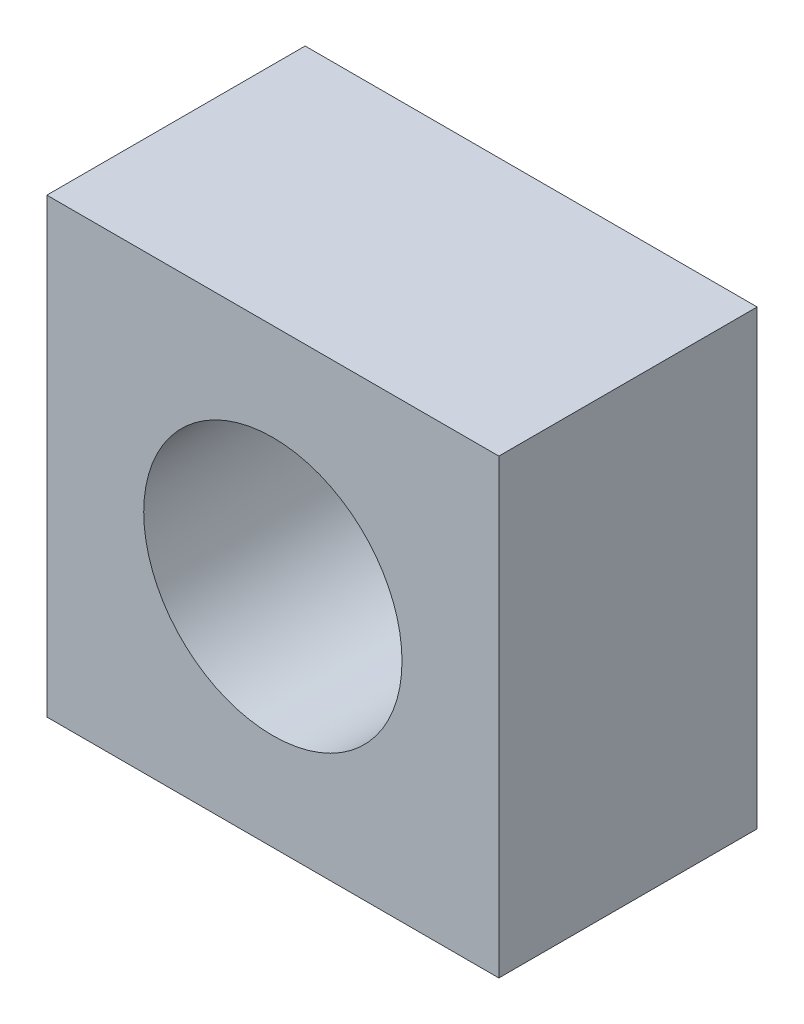
ISO-10303-21;
HEADER;
FILE_DESCRIPTION(('STEP AP214'),'2;1');
FILE_NAME('part.step','',(''),(''),'','','');
FILE_SCHEMA(('AUTOMOTIVE_DESIGN { 1 0 10303 214 1 1 1 1 }'));
ENDSEC;
DATA;
#1=APPLICATION_CONTEXT('core data for automotive mechanical design processes');
#2=APPLICATION_PROTOCOL_DEFINITION('international standard','automotive_design',2000,#1);
#3=PRODUCT_CONTEXT('',#1,'mechanical');
#4=PRODUCT('Part','Part','',(#3));
#5=PRODUCT_RELATED_PRODUCT_CATEGORY('part','',(#4));
#6=PRODUCT_DEFINITION_FORMATION('','',#4);
#7=PRODUCT_DEFINITION_CONTEXT('part definition',#1,'design');
#8=PRODUCT_DEFINITION('design','',#6,#7);
#9=PRODUCT_DEFINITION_SHAPE('','',#8);
#10=(LENGTH_UNIT() NAMED_UNIT(*) SI_UNIT(.MILLI.,.METRE.));
#11=(NAMED_UNIT(*) PLANE_ANGLE_UNIT() SI_UNIT($,.RADIAN.));
#12=(NAMED_UNIT(*) SI_UNIT($,.STERADIAN.) SOLID_ANGLE_UNIT());
#13=UNCERTAINTY_MEASURE_WITH_UNIT(LENGTH_MEASURE(1.E-05),#10,'distance_accuracy_value','');
#14=(GEOMETRIC_REPRESENTATION_CONTEXT(3) GLOBAL_UNCERTAINTY_ASSIGNED_CONTEXT((#13)) GLOBAL_UNIT_ASSIGNED_CONTEXT((#10,
#11,#12)) REPRESENTATION_CONTEXT('',''));
#15=CARTESIAN_POINT('',(0.,0.,0.));
#16=DIRECTION('',(0.,0.,1.));
#17=DIRECTION('',(1.,0.,0.));
#18=AXIS2_PLACEMENT_3D('',#15,#16,#17);
#19=CARTESIAN_POINT('',(0.,0.,12.7));
#20=DIRECTION('',(0.,0.,-1.));
#21=DIRECTION('',(-1.,0.,0.));
#22=AXIS2_PLACEMENT_3D('',#19,#20,#21);
#23=PLANE('',#22);
#24=DIRECTION('',(0.,1.,0.));
#25=VECTOR('',#24,1.);
#26=CARTESIAN_POINT('',(11.1125,-11.1125,12.7));
#27=LINE('',#26,#25);
#28=CARTESIAN_POINT('',(11.1125,-11.1125,12.7));
#29=VERTEX_POINT('',#28);
#30=CARTESIAN_POINT('',(11.1125,11.1125,12.7));
#31=VERTEX_POINT('',#30);
#32=EDGE_CURVE('E84',#29,#31,#27,.T.);
#33=ORIENTED_EDGE('',*,*,#32,.T.);
#34=DIRECTION('',(-1.,0.,0.));
#35=VECTOR('',#34,1.);
#36=CARTESIAN_POINT('',(-11.1125,11.1125,12.7));
#37=LINE('',#36,#35);
#38=CARTESIAN_POINT('',(-11.1125,11.1125,12.7));
#39=VERTEX_POINT('',#38);
#40=EDGE_CURVE('E79',#31,#39,#37,.T.);
#41=ORIENTED_EDGE('',*,*,#40,.T.);
#42=DIRECTION('',(0.,-1.,0.));
#43=VECTOR('',#42,1.);
#44=CARTESIAN_POINT('',(-11.1125,-11.1125,12.7));
#45=LINE('',#44,#43);
#46=CARTESIAN_POINT('',(-11.1125,-11.1125,12.7));
#47=VERTEX_POINT('',#46);
#48=EDGE_CURVE('E82',#39,#47,#45,.T.);
#49=ORIENTED_EDGE('',*,*,#48,.T.);
#50=DIRECTION('',(1.,0.,0.));
#51=VECTOR('',#50,1.);
#52=CARTESIAN_POINT('',(-11.1125,-11.1125,12.7));
#53=LINE('',#52,#51);
#54=EDGE_CURVE('E49',#47,#29,#53,.T.);
#55=ORIENTED_EDGE('',*,*,#54,.T.);
#56=EDGE_LOOP('',(#33,#41,#49,#55));
#57=FACE_BOUND('',#56,.T.);
#58=CARTESIAN_POINT('',(0.,0.,12.7));
#59=DIRECTION('',(0.,0.,1.));
#60=DIRECTION('',(1.,0.,0.));
#61=AXIS2_PLACEMENT_3D('',#58,#59,#60);
#62=CIRCLE('',#61,6.35);
#63=CARTESIAN_POINT('',(6.35,0.,12.7));
#64=VERTEX_POINT('',#63);
#65=EDGE_CURVE('E99',#64,#64,#62,.T.);
#66=ORIENTED_EDGE('',*,*,#65,.F.);
#67=EDGE_LOOP('',(#66));
#68=FACE_BOUND('',#67,.T.);
#69=ADVANCED_FACE('F32',(#57,#68),#23,.F.);
#70=CARTESIAN_POINT('',(0.,0.,0.));
#71=DIRECTION('',(0.,0.,-1.));
#72=DIRECTION('',(-1.,0.,0.));
#73=AXIS2_PLACEMENT_3D('',#70,#71,#72);
#74=PLANE('',#73);
#75=DIRECTION('',(0.,1.,0.));
#76=VECTOR('',#75,1.);
#77=CARTESIAN_POINT('',(11.1125,-11.1125,0.));
#78=LINE('',#77,#76);
#79=CARTESIAN_POINT('',(11.1125,-11.1125,0.));
#80=VERTEX_POINT('',#79);
#81=CARTESIAN_POINT('',(11.1125,11.1125,0.));
#82=VERTEX_POINT('',#81);
#83=EDGE_CURVE('E96',#80,#82,#78,.T.);
#84=ORIENTED_EDGE('',*,*,#83,.F.);
#85=DIRECTION('',(1.,0.,0.));
#86=VECTOR('',#85,1.);
#87=CARTESIAN_POINT('',(-11.1125,-11.1125,0.));
#88=LINE('',#87,#86);
#89=CARTESIAN_POINT('',(-11.1125,-11.1125,0.));
#90=VERTEX_POINT('',#89);
#91=EDGE_CURVE('E72',#90,#80,#88,.T.);
#92=ORIENTED_EDGE('',*,*,#91,.F.);
#93=DIRECTION('',(0.,-1.,0.));
#94=VECTOR('',#93,1.);
#95=CARTESIAN_POINT('',(-11.1125,-11.1125,0.));
#96=LINE('',#95,#94);
#97=CARTESIAN_POINT('',(-11.1125,11.1125,0.));
#98=VERTEX_POINT('',#97);
#99=EDGE_CURVE('E66',#98,#90,#96,.T.);
#100=ORIENTED_EDGE('',*,*,#99,.F.);
#101=DIRECTION('',(-1.,0.,0.));
#102=VECTOR('',#101,1.);
#103=CARTESIAN_POINT('',(-11.1125,11.1125,0.));
#104=LINE('',#103,#102);
#105=EDGE_CURVE('E88',#82,#98,#104,.T.);
#106=ORIENTED_EDGE('',*,*,#105,.F.);
#107=EDGE_LOOP('',(#84,#92,#100,#106));
#108=FACE_BOUND('',#107,.T.);
#109=CARTESIAN_POINT('',(0.,0.,0.));
#110=DIRECTION('',(0.,0.,1.));
#111=DIRECTION('',(1.,0.,0.));
#112=AXIS2_PLACEMENT_3D('',#109,#110,#111);
#113=CIRCLE('',#112,6.35);
#114=CARTESIAN_POINT('',(6.35,0.,0.));
#115=VERTEX_POINT('',#114);
#116=EDGE_CURVE('E111',#115,#115,#113,.T.);
#117=ORIENTED_EDGE('',*,*,#116,.T.);
#118=EDGE_LOOP('',(#117));
#119=FACE_BOUND('',#118,.T.);
#120=ADVANCED_FACE('F107',(#108,#119),#74,.T.);
#121=CARTESIAN_POINT('',(11.1125,-11.1125,12.7));
#122=DIRECTION('',(-1.,0.,0.));
#123=DIRECTION('',(0.,0.,1.));
#124=AXIS2_PLACEMENT_3D('',#121,#122,#123);
#125=PLANE('',#124);
#126=ORIENTED_EDGE('',*,*,#83,.T.);
#127=DIRECTION('',(0.,0.,-1.));
#128=VECTOR('',#127,1.);
#129=CARTESIAN_POINT('',(11.1125,11.1125,12.7));
#130=LINE('',#129,#128);
#131=EDGE_CURVE('E11',#31,#82,#130,.T.);
#132=ORIENTED_EDGE('',*,*,#131,.F.);
#133=ORIENTED_EDGE('',*,*,#32,.F.);
#134=DIRECTION('',(0.,0.,-1.));
#135=VECTOR('',#134,1.);
#136=CARTESIAN_POINT('',(11.1125,-11.1125,12.7));
#137=LINE('',#136,#135);
#138=EDGE_CURVE('E92',#29,#80,#137,.T.);
#139=ORIENTED_EDGE('',*,*,#138,.T.);
#140=EDGE_LOOP('',(#126,#132,#133,#139));
#141=FACE_BOUND('',#140,.T.);
#142=ADVANCED_FACE('F34',(#141),#125,.F.);
#143=CARTESIAN_POINT('',(-11.1125,11.1125,12.7));
#144=DIRECTION('',(0.,-1.,0.));
#145=DIRECTION('',(0.,0.,-1.));
#146=AXIS2_PLACEMENT_3D('',#143,#144,#145);
#147=PLANE('',#146);
#148=ORIENTED_EDGE('',*,*,#105,.T.);
#149=DIRECTION('',(0.,0.,-1.));
#150=VECTOR('',#149,1.);
#151=CARTESIAN_POINT('',(-11.1125,11.1125,12.7));
#152=LINE('',#151,#150);
#153=EDGE_CURVE('E41',#39,#98,#152,.T.);
#154=ORIENTED_EDGE('',*,*,#153,.F.);
#155=ORIENTED_EDGE('',*,*,#40,.F.);
#156=ORIENTED_EDGE('',*,*,#131,.T.);
#157=EDGE_LOOP('',(#148,#154,#155,#156));
#158=FACE_BOUND('',#157,.T.);
#159=ADVANCED_FACE('F87',(#158),#147,.F.);
#160=CARTESIAN_POINT('',(-11.1125,-11.1125,12.7));
#161=DIRECTION('',(1.,0.,0.));
#162=DIRECTION('',(0.,0.,-1.));
#163=AXIS2_PLACEMENT_3D('',#160,#161,#162);
#164=PLANE('',#163);
#165=ORIENTED_EDGE('',*,*,#99,.T.);
#166=DIRECTION('',(0.,0.,-1.));
#167=VECTOR('',#166,1.);
#168=CARTESIAN_POINT('',(-11.1125,-11.1125,12.7));
#169=LINE('',#168,#167);
#170=EDGE_CURVE('E89',#47,#90,#169,.T.);
#171=ORIENTED_EDGE('',*,*,#170,.F.);
#172=ORIENTED_EDGE('',*,*,#48,.F.);
#173=ORIENTED_EDGE('',*,*,#153,.T.);
#174=EDGE_LOOP('',(#165,#171,#172,#173));
#175=FACE_BOUND('',#174,.T.);
#176=ADVANCED_FACE('F90',(#175),#164,.F.);
#177=CARTESIAN_POINT('',(-11.1125,-11.1125,12.7));
#178=DIRECTION('',(0.,1.,0.));
#179=DIRECTION('',(0.,0.,1.));
#180=AXIS2_PLACEMENT_3D('',#177,#178,#179);
#181=PLANE('',#180);
#182=ORIENTED_EDGE('',*,*,#91,.T.);
#183=ORIENTED_EDGE('',*,*,#138,.F.);
#184=ORIENTED_EDGE('',*,*,#54,.F.);
#185=ORIENTED_EDGE('',*,*,#170,.T.);
#186=EDGE_LOOP('',(#182,#183,#184,#185));
#187=FACE_BOUND('',#186,.T.);
#188=ADVANCED_FACE('F104',(#187),#181,.F.);
#189=CARTESIAN_POINT('',(0.,0.,12.7));
#190=DIRECTION('',(0.,0.,-1.));
#191=DIRECTION('',(-1.,0.,0.));
#192=AXIS2_PLACEMENT_3D('',#189,#190,#191);
#193=CYLINDRICAL_SURFACE('',#192,6.35);
#194=ORIENTED_EDGE('',*,*,#65,.T.);
#195=EDGE_LOOP('',(#194));
#196=FACE_BOUND('',#195,.T.);
#197=ORIENTED_EDGE('',*,*,#116,.F.);
#198=EDGE_LOOP('',(#197));
#199=FACE_BOUND('',#198,.T.);
#200=ADVANCED_FACE('F117',(#196,#199),#193,.F.);
#201=CLOSED_SHELL('',(#69,#120,#142,#159,#176,#188,#200));
#202=MANIFOLD_SOLID_BREP('B2',#201);
#203=ADVANCED_BREP_SHAPE_REPRESENTATION('',(#18,#202),#14);
#204=SHAPE_DEFINITION_REPRESENTATION(#9,#203);
ENDSEC;
END-ISO-10303-21;
